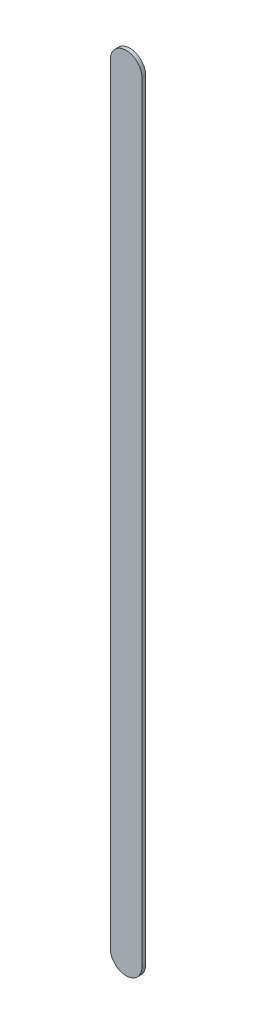
ISO-10303-21;
HEADER;
FILE_DESCRIPTION(('STEP AP214'),'2;1');
FILE_NAME('part.step','',(''),(''),'','','');
FILE_SCHEMA(('AUTOMOTIVE_DESIGN { 1 0 10303 214 1 1 1 1 }'));
ENDSEC;
DATA;
#1=APPLICATION_CONTEXT('core data for automotive mechanical design processes');
#2=APPLICATION_PROTOCOL_DEFINITION('international standard','automotive_design',2000,#1);
#3=PRODUCT_CONTEXT('',#1,'mechanical');
#4=PRODUCT('Part','Part','',(#3));
#5=PRODUCT_RELATED_PRODUCT_CATEGORY('part','',(#4));
#6=PRODUCT_DEFINITION_FORMATION('','',#4);
#7=PRODUCT_DEFINITION_CONTEXT('part definition',#1,'design');
#8=PRODUCT_DEFINITION('design','',#6,#7);
#9=PRODUCT_DEFINITION_SHAPE('','',#8);
#10=(LENGTH_UNIT() NAMED_UNIT(*) SI_UNIT(.MILLI.,.METRE.));
#11=(NAMED_UNIT(*) PLANE_ANGLE_UNIT() SI_UNIT($,.RADIAN.));
#12=(NAMED_UNIT(*) SI_UNIT($,.STERADIAN.) SOLID_ANGLE_UNIT());
#13=UNCERTAINTY_MEASURE_WITH_UNIT(LENGTH_MEASURE(1.E-05),#10,'distance_accuracy_value','');
#14=(GEOMETRIC_REPRESENTATION_CONTEXT(3) GLOBAL_UNCERTAINTY_ASSIGNED_CONTEXT((#13)) GLOBAL_UNIT_ASSIGNED_CONTEXT((#10,
#11,#12)) REPRESENTATION_CONTEXT('',''));
#15=CARTESIAN_POINT('',(0.,0.,0.));
#16=DIRECTION('',(0.,0.,1.));
#17=DIRECTION('',(1.,0.,0.));
#18=AXIS2_PLACEMENT_3D('',#15,#16,#17);
#19=CARTESIAN_POINT('',(166.9,-61.85,1.635));
#20=DIRECTION('',(0.,0.,1.));
#21=DIRECTION('',(1.,0.,0.));
#22=AXIS2_PLACEMENT_3D('',#19,#20,#21);
#23=PLANE('',#22);
#24=DIRECTION('',(0.,-1.,0.));
#25=VECTOR('',#24,1.);
#26=CARTESIAN_POINT('',(166.9,-61.85,1.635));
#27=LINE('',#26,#25);
#28=CARTESIAN_POINT('',(166.9,-61.85,1.635));
#29=VERTEX_POINT('',#28);
#30=CARTESIAN_POINT('',(166.9,-69.14,1.635));
#31=VERTEX_POINT('',#30);
#32=EDGE_CURVE('E82',#29,#31,#27,.T.);
#33=ORIENTED_EDGE('',*,*,#32,.T.);
#34=CARTESIAN_POINT('',(167.05,-69.14,1.635));
#35=DIRECTION('',(0.,0.,1.));
#36=DIRECTION('',(-1.,0.,0.));
#37=AXIS2_PLACEMENT_3D('',#34,#35,#36);
#38=CIRCLE('',#37,0.15);
#39=CARTESIAN_POINT('',(167.2,-69.14,1.635));
#40=VERTEX_POINT('',#39);
#41=EDGE_CURVE('E104',#31,#40,#38,.T.);
#42=ORIENTED_EDGE('',*,*,#41,.T.);
#43=DIRECTION('',(0.,1.,0.));
#44=VECTOR('',#43,1.);
#45=CARTESIAN_POINT('',(167.2,-69.14,1.635));
#46=LINE('',#45,#44);
#47=CARTESIAN_POINT('',(167.2,-61.85,1.635));
#48=VERTEX_POINT('',#47);
#49=EDGE_CURVE('E75',#40,#48,#46,.T.);
#50=ORIENTED_EDGE('',*,*,#49,.T.);
#51=CARTESIAN_POINT('',(167.05,-61.85,1.635));
#52=DIRECTION('',(0.,0.,1.));
#53=DIRECTION('',(1.,0.,0.));
#54=AXIS2_PLACEMENT_3D('',#51,#52,#53);
#55=CIRCLE('',#54,0.15);
#56=EDGE_CURVE('E11',#48,#29,#55,.T.);
#57=ORIENTED_EDGE('',*,*,#56,.T.);
#58=EDGE_LOOP('',(#33,#42,#50,#57));
#59=FACE_BOUND('',#58,.T.);
#60=ADVANCED_FACE('F17',(#59),#23,.T.);
#61=CARTESIAN_POINT('',(166.9,-61.85,1.6));
#62=DIRECTION('',(0.,0.,1.));
#63=DIRECTION('',(1.,0.,0.));
#64=AXIS2_PLACEMENT_3D('',#61,#62,#63);
#65=PLANE('',#64);
#66=CARTESIAN_POINT('',(167.05,-61.85,1.6));
#67=DIRECTION('',(0.,0.,1.));
#68=DIRECTION('',(1.,0.,0.));
#69=AXIS2_PLACEMENT_3D('',#66,#67,#68);
#70=CIRCLE('',#69,0.15);
#71=CARTESIAN_POINT('',(167.2,-61.85,1.6));
#72=VERTEX_POINT('',#71);
#73=CARTESIAN_POINT('',(166.9,-61.85,1.6));
#74=VERTEX_POINT('',#73);
#75=EDGE_CURVE('E20',#72,#74,#70,.T.);
#76=ORIENTED_EDGE('',*,*,#75,.F.);
#77=DIRECTION('',(0.,1.,0.));
#78=VECTOR('',#77,1.);
#79=CARTESIAN_POINT('',(167.2,-69.14,1.6));
#80=LINE('',#79,#78);
#81=CARTESIAN_POINT('',(167.2,-69.14,1.6));
#82=VERTEX_POINT('',#81);
#83=EDGE_CURVE('E108',#82,#72,#80,.T.);
#84=ORIENTED_EDGE('',*,*,#83,.F.);
#85=CARTESIAN_POINT('',(167.05,-69.14,1.6));
#86=DIRECTION('',(0.,0.,1.));
#87=DIRECTION('',(-1.,0.,0.));
#88=AXIS2_PLACEMENT_3D('',#85,#86,#87);
#89=CIRCLE('',#88,0.15);
#90=CARTESIAN_POINT('',(166.9,-69.14,1.6));
#91=VERTEX_POINT('',#90);
#92=EDGE_CURVE('E84',#91,#82,#89,.T.);
#93=ORIENTED_EDGE('',*,*,#92,.F.);
#94=DIRECTION('',(0.,-1.,0.));
#95=VECTOR('',#94,1.);
#96=CARTESIAN_POINT('',(166.9,-61.85,1.6));
#97=LINE('',#96,#95);
#98=EDGE_CURVE('E80',#74,#91,#97,.T.);
#99=ORIENTED_EDGE('',*,*,#98,.F.);
#100=EDGE_LOOP('',(#76,#84,#93,#99));
#101=FACE_BOUND('',#100,.T.);
#102=ADVANCED_FACE('F86',(#101),#65,.F.);
#103=CARTESIAN_POINT('',(167.05,-61.85,1.6));
#104=DIRECTION('',(0.,0.,-1.));
#105=DIRECTION('',(1.,0.,0.));
#106=AXIS2_PLACEMENT_3D('',#103,#104,#105);
#107=CYLINDRICAL_SURFACE('',#106,0.15);
#108=ORIENTED_EDGE('',*,*,#75,.T.);
#109=DIRECTION('',(0.,0.,1.));
#110=VECTOR('',#109,1.);
#111=CARTESIAN_POINT('',(166.9,-61.85,1.6));
#112=LINE('',#111,#110);
#113=EDGE_CURVE('E69',#74,#29,#112,.T.);
#114=ORIENTED_EDGE('',*,*,#113,.T.);
#115=ORIENTED_EDGE('',*,*,#56,.F.);
#116=DIRECTION('',(0.,0.,1.));
#117=VECTOR('',#116,1.);
#118=CARTESIAN_POINT('',(167.2,-61.85,1.6));
#119=LINE('',#118,#117);
#120=EDGE_CURVE('E72',#72,#48,#119,.T.);
#121=ORIENTED_EDGE('',*,*,#120,.F.);
#122=EDGE_LOOP('',(#108,#114,#115,#121));
#123=FACE_BOUND('',#122,.T.);
#124=ADVANCED_FACE('F68',(#123),#107,.T.);
#125=CARTESIAN_POINT('',(167.2,-69.14,1.6));
#126=DIRECTION('',(-1.,0.,0.));
#127=DIRECTION('',(0.,0.,1.));
#128=AXIS2_PLACEMENT_3D('',#125,#126,#127);
#129=PLANE('',#128);
#130=ORIENTED_EDGE('',*,*,#83,.T.);
#131=ORIENTED_EDGE('',*,*,#120,.T.);
#132=ORIENTED_EDGE('',*,*,#49,.F.);
#133=DIRECTION('',(0.,0.,1.));
#134=VECTOR('',#133,1.);
#135=CARTESIAN_POINT('',(167.2,-69.14,1.6));
#136=LINE('',#135,#134);
#137=EDGE_CURVE('E101',#82,#40,#136,.T.);
#138=ORIENTED_EDGE('',*,*,#137,.F.);
#139=EDGE_LOOP('',(#130,#131,#132,#138));
#140=FACE_BOUND('',#139,.T.);
#141=ADVANCED_FACE('F122',(#140),#129,.F.);
#142=CARTESIAN_POINT('',(167.05,-69.14,1.6));
#143=DIRECTION('',(0.,0.,-1.));
#144=DIRECTION('',(-1.,0.,0.));
#145=AXIS2_PLACEMENT_3D('',#142,#143,#144);
#146=CYLINDRICAL_SURFACE('',#145,0.15);
#147=ORIENTED_EDGE('',*,*,#92,.T.);
#148=ORIENTED_EDGE('',*,*,#137,.T.);
#149=ORIENTED_EDGE('',*,*,#41,.F.);
#150=DIRECTION('',(0.,0.,1.));
#151=VECTOR('',#150,1.);
#152=CARTESIAN_POINT('',(166.9,-69.14,1.6));
#153=LINE('',#152,#151);
#154=EDGE_CURVE('E90',#91,#31,#153,.T.);
#155=ORIENTED_EDGE('',*,*,#154,.F.);
#156=EDGE_LOOP('',(#147,#148,#149,#155));
#157=FACE_BOUND('',#156,.T.);
#158=ADVANCED_FACE('F124',(#157),#146,.T.);
#159=CARTESIAN_POINT('',(166.9,-61.85,1.6));
#160=DIRECTION('',(1.,0.,0.));
#161=DIRECTION('',(0.,1.,0.));
#162=AXIS2_PLACEMENT_3D('',#159,#160,#161);
#163=PLANE('',#162);
#164=ORIENTED_EDGE('',*,*,#98,.T.);
#165=ORIENTED_EDGE('',*,*,#154,.T.);
#166=ORIENTED_EDGE('',*,*,#32,.F.);
#167=ORIENTED_EDGE('',*,*,#113,.F.);
#168=EDGE_LOOP('',(#164,#165,#166,#167));
#169=FACE_BOUND('',#168,.T.);
#170=ADVANCED_FACE('F78',(#169),#163,.F.);
#171=CLOSED_SHELL('',(#60,#102,#124,#141,#158,#170));
#172=MANIFOLD_SOLID_BREP('B1',#171);
#173=ADVANCED_BREP_SHAPE_REPRESENTATION('',(#18,#172),#14);
#174=SHAPE_DEFINITION_REPRESENTATION(#9,#173);
ENDSEC;
END-ISO-10303-21;
